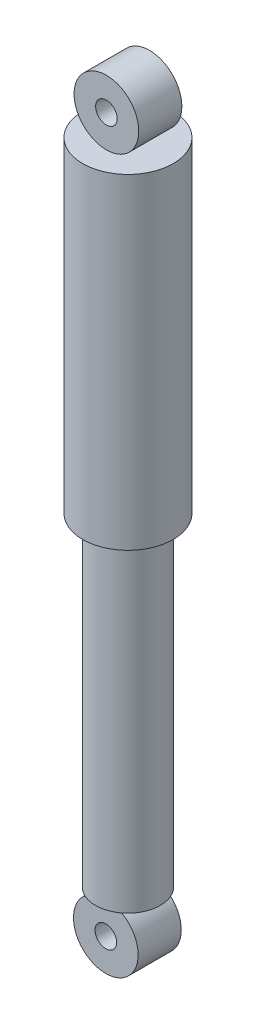
ISO-10303-21;
HEADER;
FILE_DESCRIPTION(('STEP AP214'),'2;1');
FILE_NAME('part.step','',(''),(''),'','','');
FILE_SCHEMA(('AUTOMOTIVE_DESIGN { 1 0 10303 214 1 1 1 1 }'));
ENDSEC;
DATA;
#1=APPLICATION_CONTEXT('core data for automotive mechanical design processes');
#2=APPLICATION_PROTOCOL_DEFINITION('international standard','automotive_design',2000,#1);
#3=PRODUCT_CONTEXT('',#1,'mechanical');
#4=PRODUCT('Part','Part','',(#3));
#5=PRODUCT_RELATED_PRODUCT_CATEGORY('part','',(#4));
#6=PRODUCT_DEFINITION_FORMATION('','',#4);
#7=PRODUCT_DEFINITION_CONTEXT('part definition',#1,'design');
#8=PRODUCT_DEFINITION('design','',#6,#7);
#9=PRODUCT_DEFINITION_SHAPE('','',#8);
#10=(LENGTH_UNIT() NAMED_UNIT(*) SI_UNIT(.MILLI.,.METRE.));
#11=(NAMED_UNIT(*) PLANE_ANGLE_UNIT() SI_UNIT($,.RADIAN.));
#12=(NAMED_UNIT(*) SI_UNIT($,.STERADIAN.) SOLID_ANGLE_UNIT());
#13=UNCERTAINTY_MEASURE_WITH_UNIT(LENGTH_MEASURE(1.E-05),#10,'distance_accuracy_value','');
#14=(GEOMETRIC_REPRESENTATION_CONTEXT(3) GLOBAL_UNCERTAINTY_ASSIGNED_CONTEXT((#13)) GLOBAL_UNIT_ASSIGNED_CONTEXT((#10,
#11,#12)) REPRESENTATION_CONTEXT('',''));
#15=CARTESIAN_POINT('',(0.,0.,0.));
#16=DIRECTION('',(0.,0.,1.));
#17=DIRECTION('',(1.,0.,0.));
#18=AXIS2_PLACEMENT_3D('',#15,#16,#17);
#19=CARTESIAN_POINT('',(0.278925530166028,331.,20.));
#20=DIRECTION('',(0.,0.,-1.));
#21=DIRECTION('',(-1.,0.,0.));
#22=AXIS2_PLACEMENT_3D('',#19,#20,#21);
#23=CYLINDRICAL_SURFACE('',#22,5.);
#24=CARTESIAN_POINT('',(0.278925530166028,331.,20.));
#25=DIRECTION('',(0.,0.,1.));
#26=DIRECTION('',(1.,0.,0.));
#27=AXIS2_PLACEMENT_3D('',#24,#25,#26);
#28=CIRCLE('',#27,5.);
#29=CARTESIAN_POINT('',(5.27892553016603,331.,20.));
#30=VERTEX_POINT('',#29);
#31=EDGE_CURVE('E49',#30,#30,#28,.T.);
#32=ORIENTED_EDGE('',*,*,#31,.T.);
#33=EDGE_LOOP('',(#32));
#34=FACE_BOUND('',#33,.T.);
#35=CARTESIAN_POINT('',(0.278925530166028,331.,0.));
#36=DIRECTION('',(0.,0.,1.));
#37=DIRECTION('',(1.,0.,0.));
#38=AXIS2_PLACEMENT_3D('',#35,#36,#37);
#39=CIRCLE('',#38,5.);
#40=CARTESIAN_POINT('',(5.27892553016603,331.,0.));
#41=VERTEX_POINT('',#40);
#42=EDGE_CURVE('E55',#41,#41,#39,.T.);
#43=ORIENTED_EDGE('',*,*,#42,.F.);
#44=EDGE_LOOP('',(#43));
#45=FACE_BOUND('',#44,.T.);
#46=ADVANCED_FACE('F42',(#34,#45),#23,.F.);
#47=CARTESIAN_POINT('',(0.278925530166028,331.,20.));
#48=DIRECTION('',(0.,0.,-1.));
#49=DIRECTION('',(-1.,0.,0.));
#50=AXIS2_PLACEMENT_3D('',#47,#48,#49);
#51=CYLINDRICAL_SURFACE('',#50,15.);
#52=CARTESIAN_POINT('',(0.278925530166028,331.,20.));
#53=DIRECTION('',(0.,0.,1.));
#54=DIRECTION('',(1.,0.,0.));
#55=AXIS2_PLACEMENT_3D('',#52,#53,#54);
#56=CIRCLE('',#55,15.);
#57=CARTESIAN_POINT('',(15.278925530166,331.,20.));
#58=VERTEX_POINT('',#57);
#59=EDGE_CURVE('E11',#58,#58,#56,.T.);
#60=ORIENTED_EDGE('',*,*,#59,.F.);
#61=EDGE_LOOP('',(#60));
#62=FACE_BOUND('',#61,.T.);
#63=CARTESIAN_POINT('',(0.278925530166028,331.,0.));
#64=DIRECTION('',(0.,0.,1.));
#65=DIRECTION('',(1.,0.,0.));
#66=AXIS2_PLACEMENT_3D('',#63,#64,#65);
#67=CIRCLE('',#66,15.);
#68=CARTESIAN_POINT('',(15.278925530166,331.,0.));
#69=VERTEX_POINT('',#68);
#70=EDGE_CURVE('E45',#69,#69,#67,.T.);
#71=ORIENTED_EDGE('',*,*,#70,.T.);
#72=EDGE_LOOP('',(#71));
#73=FACE_BOUND('',#72,.T.);
#74=ADVANCED_FACE('F62',(#62,#73),#51,.T.);
#75=CARTESIAN_POINT('',(0.,0.,20.));
#76=DIRECTION('',(0.,0.,1.));
#77=DIRECTION('',(1.,0.,0.));
#78=AXIS2_PLACEMENT_3D('',#75,#76,#77);
#79=PLANE('',#78);
#80=ORIENTED_EDGE('',*,*,#31,.F.);
#81=EDGE_LOOP('',(#80));
#82=FACE_BOUND('',#81,.T.);
#83=ORIENTED_EDGE('',*,*,#59,.T.);
#84=EDGE_LOOP('',(#83));
#85=FACE_BOUND('',#84,.T.);
#86=ADVANCED_FACE('F66',(#82,#85),#79,.T.);
#87=CARTESIAN_POINT('',(0.,0.,0.));
#88=DIRECTION('',(0.,0.,1.));
#89=DIRECTION('',(1.,0.,0.));
#90=AXIS2_PLACEMENT_3D('',#87,#88,#89);
#91=PLANE('',#90);
#92=ORIENTED_EDGE('',*,*,#42,.T.);
#93=EDGE_LOOP('',(#92));
#94=FACE_BOUND('',#93,.T.);
#95=ORIENTED_EDGE('',*,*,#70,.F.);
#96=EDGE_LOOP('',(#95));
#97=FACE_BOUND('',#96,.T.);
#98=ADVANCED_FACE('F64',(#94,#97),#91,.F.);
#99=CLOSED_SHELL('',(#46,#74,#86,#98));
#100=MANIFOLD_SOLID_BREP('B2',#99);
#101=CARTESIAN_POINT('',(0.278925530166028,165.,10.));
#102=DIRECTION('',(0.,1.,0.));
#103=DIRECTION('',(0.,0.,1.));
#104=AXIS2_PLACEMENT_3D('',#101,#102,#103);
#105=PLANE('',#104);
#106=CARTESIAN_POINT('',(0.278925530166028,165.,10.));
#107=DIRECTION('',(0.,1.,0.));
#108=DIRECTION('',(0.,0.,1.));
#109=AXIS2_PLACEMENT_3D('',#106,#107,#108);
#110=CIRCLE('',#109,21.);
#111=CARTESIAN_POINT('',(0.278925530166028,165.,31.));
#112=VERTEX_POINT('',#111);
#113=EDGE_CURVE('E41',#112,#112,#110,.T.);
#114=ORIENTED_EDGE('',*,*,#113,.F.);
#115=EDGE_LOOP('',(#114));
#116=FACE_BOUND('',#115,.T.);
#117=CARTESIAN_POINT('',(0.278925530166028,165.,10.));
#118=DIRECTION('',(0.,1.,0.));
#119=DIRECTION('',(0.,0.,1.));
#120=AXIS2_PLACEMENT_3D('',#117,#118,#119);
#121=CIRCLE('',#120,15.5);
#122=CARTESIAN_POINT('',(0.278925530166028,165.,25.5));
#123=VERTEX_POINT('',#122);
#124=EDGE_CURVE('E119',#123,#123,#121,.T.);
#125=ORIENTED_EDGE('',*,*,#124,.T.);
#126=EDGE_LOOP('',(#125));
#127=FACE_BOUND('',#126,.T.);
#128=ADVANCED_FACE('F112',(#116,#127),#105,.F.);
#129=CARTESIAN_POINT('',(0.278925530166028,315.,10.));
#130=DIRECTION('',(0.,-1.,0.));
#131=DIRECTION('',(0.,0.,-1.));
#132=AXIS2_PLACEMENT_3D('',#129,#130,#131);
#133=CYLINDRICAL_SURFACE('',#132,21.);
#134=ORIENTED_EDGE('',*,*,#113,.T.);
#135=EDGE_LOOP('',(#134));
#136=FACE_BOUND('',#135,.T.);
#137=CARTESIAN_POINT('',(0.278925530166028,316.,10.));
#138=DIRECTION('',(0.,1.,0.));
#139=DIRECTION('',(0.,0.,1.));
#140=AXIS2_PLACEMENT_3D('',#137,#138,#139);
#141=CIRCLE('',#140,21.);
#142=CARTESIAN_POINT('',(0.278925530166028,316.,31.));
#143=VERTEX_POINT('',#142);
#144=EDGE_CURVE('E127',#143,#143,#141,.T.);
#145=ORIENTED_EDGE('',*,*,#144,.F.);
#146=EDGE_LOOP('',(#145));
#147=FACE_BOUND('',#146,.T.);
#148=ADVANCED_FACE('F114',(#136,#147),#133,.T.);
#149=CARTESIAN_POINT('',(0.278925530166028,315.,10.));
#150=DIRECTION('',(0.,-1.,0.));
#151=DIRECTION('',(0.,0.,-1.));
#152=AXIS2_PLACEMENT_3D('',#149,#150,#151);
#153=CYLINDRICAL_SURFACE('',#152,15.5);
#154=CARTESIAN_POINT('',(0.278925530166028,315.,10.));
#155=DIRECTION('',(0.,1.,0.));
#156=DIRECTION('',(0.,0.,1.));
#157=AXIS2_PLACEMENT_3D('',#154,#155,#156);
#158=CIRCLE('',#157,15.5);
#159=CARTESIAN_POINT('',(0.278925530166028,315.,25.5));
#160=VERTEX_POINT('',#159);
#161=EDGE_CURVE('E123',#160,#160,#158,.T.);
#162=ORIENTED_EDGE('',*,*,#161,.T.);
#163=EDGE_LOOP('',(#162));
#164=FACE_BOUND('',#163,.T.);
#165=ORIENTED_EDGE('',*,*,#124,.F.);
#166=EDGE_LOOP('',(#165));
#167=FACE_BOUND('',#166,.T.);
#168=ADVANCED_FACE('F136',(#164,#167),#153,.F.);
#169=CARTESIAN_POINT('',(0.278925530166028,315.,10.));
#170=DIRECTION('',(0.,1.,0.));
#171=DIRECTION('',(0.,0.,1.));
#172=AXIS2_PLACEMENT_3D('',#169,#170,#171);
#173=PLANE('',#172);
#174=ORIENTED_EDGE('',*,*,#161,.F.);
#175=EDGE_LOOP('',(#174));
#176=FACE_BOUND('',#175,.T.);
#177=ADVANCED_FACE('F141',(#176),#173,.F.);
#178=CARTESIAN_POINT('',(0.278925530166028,316.,10.));
#179=DIRECTION('',(0.,1.,0.));
#180=DIRECTION('',(0.,0.,1.));
#181=AXIS2_PLACEMENT_3D('',#178,#179,#180);
#182=PLANE('',#181);
#183=ORIENTED_EDGE('',*,*,#144,.T.);
#184=EDGE_LOOP('',(#183));
#185=FACE_BOUND('',#184,.T.);
#186=ADVANCED_FACE('F133',(#185),#182,.T.);
#187=CLOSED_SHELL('',(#128,#148,#168,#177,#186));
#188=MANIFOLD_SOLID_BREP('B6',#187);
#189=CARTESIAN_POINT('',(0.278925530166028,165.,10.));
#190=DIRECTION('',(0.,-1.,0.));
#191=DIRECTION('',(0.,0.,-1.));
#192=AXIS2_PLACEMENT_3D('',#189,#190,#191);
#193=CYLINDRICAL_SURFACE('',#192,15.);
#194=CARTESIAN_POINT('',(0.278925530166028,165.,10.));
#195=DIRECTION('',(0.,1.,0.));
#196=DIRECTION('',(0.,0.,1.));
#197=AXIS2_PLACEMENT_3D('',#194,#195,#196);
#198=CIRCLE('',#197,15.);
#199=CARTESIAN_POINT('',(0.278925530166028,165.,25.));
#200=VERTEX_POINT('',#199);
#201=EDGE_CURVE('E111',#200,#200,#198,.T.);
#202=ORIENTED_EDGE('',*,*,#201,.F.);
#203=EDGE_LOOP('',(#202));
#204=FACE_BOUND('',#203,.T.);
#205=CARTESIAN_POINT('',(0.278925530166028,15.,10.));
#206=DIRECTION('',(0.,1.,0.));
#207=DIRECTION('',(0.,0.,1.));
#208=AXIS2_PLACEMENT_3D('',#205,#206,#207);
#209=CIRCLE('',#208,15.);
#210=CARTESIAN_POINT('',(0.278925530166028,15.,25.));
#211=VERTEX_POINT('',#210);
#212=EDGE_CURVE('E194',#211,#211,#209,.T.);
#213=ORIENTED_EDGE('',*,*,#212,.T.);
#214=EDGE_LOOP('',(#213));
#215=FACE_BOUND('',#214,.T.);
#216=ADVANCED_FACE('F191',(#204,#215),#193,.T.);
#217=CARTESIAN_POINT('',(0.278925530166028,165.,10.));
#218=DIRECTION('',(0.,1.,0.));
#219=DIRECTION('',(0.,0.,1.));
#220=AXIS2_PLACEMENT_3D('',#217,#218,#219);
#221=PLANE('',#220);
#222=ORIENTED_EDGE('',*,*,#201,.T.);
#223=EDGE_LOOP('',(#222));
#224=FACE_BOUND('',#223,.T.);
#225=ADVANCED_FACE('F206',(#224),#221,.T.);
#226=CARTESIAN_POINT('',(0.278925530166028,15.,10.));
#227=DIRECTION('',(0.,1.,0.));
#228=DIRECTION('',(0.,0.,1.));
#229=AXIS2_PLACEMENT_3D('',#226,#227,#228);
#230=PLANE('',#229);
#231=ORIENTED_EDGE('',*,*,#212,.F.);
#232=EDGE_LOOP('',(#231));
#233=FACE_BOUND('',#232,.T.);
#234=ADVANCED_FACE('F204',(#233),#230,.F.);
#235=CLOSED_SHELL('',(#216,#225,#234));
#236=MANIFOLD_SOLID_BREP('B36',#235);
#237=CARTESIAN_POINT('',(0.,0.,20.));
#238=DIRECTION('',(0.,0.,-1.));
#239=DIRECTION('',(-1.,0.,0.));
#240=AXIS2_PLACEMENT_3D('',#237,#238,#239);
#241=CYLINDRICAL_SURFACE('',#240,15.);
#242=CARTESIAN_POINT('',(0.,0.,20.));
#243=DIRECTION('',(0.,0.,1.));
#244=DIRECTION('',(1.,0.,0.));
#245=AXIS2_PLACEMENT_3D('',#242,#243,#244);
#246=CIRCLE('',#245,15.);
#247=CARTESIAN_POINT('',(15.,0.,20.));
#248=VERTEX_POINT('',#247);
#249=EDGE_CURVE('E190',#248,#248,#246,.T.);
#250=ORIENTED_EDGE('',*,*,#249,.F.);
#251=EDGE_LOOP('',(#250));
#252=FACE_BOUND('',#251,.T.);
#253=CARTESIAN_POINT('',(0.,0.,0.));
#254=DIRECTION('',(0.,0.,1.));
#255=DIRECTION('',(1.,0.,0.));
#256=AXIS2_PLACEMENT_3D('',#253,#254,#255);
#257=CIRCLE('',#256,15.);
#258=CARTESIAN_POINT('',(15.,0.,0.));
#259=VERTEX_POINT('',#258);
#260=EDGE_CURVE('E235',#259,#259,#257,.T.);
#261=ORIENTED_EDGE('',*,*,#260,.T.);
#262=EDGE_LOOP('',(#261));
#263=FACE_BOUND('',#262,.T.);
#264=ADVANCED_FACE('F232',(#252,#263),#241,.T.);
#265=CARTESIAN_POINT('',(0.,0.,20.));
#266=DIRECTION('',(0.,0.,1.));
#267=DIRECTION('',(1.,0.,0.));
#268=AXIS2_PLACEMENT_3D('',#265,#266,#267);
#269=PLANE('',#268);
#270=CARTESIAN_POINT('',(0.,0.,20.));
#271=DIRECTION('',(0.,0.,1.));
#272=DIRECTION('',(1.,0.,0.));
#273=AXIS2_PLACEMENT_3D('',#270,#271,#272);
#274=CIRCLE('',#273,5.);
#275=CARTESIAN_POINT('',(5.,0.,20.));
#276=VERTEX_POINT('',#275);
#277=EDGE_CURVE('E244',#276,#276,#274,.T.);
#278=ORIENTED_EDGE('',*,*,#277,.F.);
#279=EDGE_LOOP('',(#278));
#280=FACE_BOUND('',#279,.T.);
#281=ORIENTED_EDGE('',*,*,#249,.T.);
#282=EDGE_LOOP('',(#281));
#283=FACE_BOUND('',#282,.T.);
#284=ADVANCED_FACE('F259',(#280,#283),#269,.T.);
#285=CARTESIAN_POINT('',(0.,0.,0.));
#286=DIRECTION('',(0.,0.,1.));
#287=DIRECTION('',(1.,0.,0.));
#288=AXIS2_PLACEMENT_3D('',#285,#286,#287);
#289=PLANE('',#288);
#290=CARTESIAN_POINT('',(0.,0.,0.));
#291=DIRECTION('',(0.,0.,1.));
#292=DIRECTION('',(1.,0.,0.));
#293=AXIS2_PLACEMENT_3D('',#290,#291,#292);
#294=CIRCLE('',#293,5.);
#295=CARTESIAN_POINT('',(5.,0.,0.));
#296=VERTEX_POINT('',#295);
#297=EDGE_CURVE('E242',#296,#296,#294,.T.);
#298=ORIENTED_EDGE('',*,*,#297,.T.);
#299=EDGE_LOOP('',(#298));
#300=FACE_BOUND('',#299,.T.);
#301=ORIENTED_EDGE('',*,*,#260,.F.);
#302=EDGE_LOOP('',(#301));
#303=FACE_BOUND('',#302,.T.);
#304=ADVANCED_FACE('F250',(#300,#303),#289,.F.);
#305=CARTESIAN_POINT('',(0.,0.,0.));
#306=DIRECTION('',(0.,0.,1.));
#307=DIRECTION('',(1.,0.,0.));
#308=AXIS2_PLACEMENT_3D('',#305,#306,#307);
#309=CYLINDRICAL_SURFACE('',#308,5.);
#310=ORIENTED_EDGE('',*,*,#297,.F.);
#311=EDGE_LOOP('',(#310));
#312=FACE_BOUND('',#311,.T.);
#313=ORIENTED_EDGE('',*,*,#277,.T.);
#314=EDGE_LOOP('',(#313));
#315=FACE_BOUND('',#314,.T.);
#316=ADVANCED_FACE('F253',(#312,#315),#309,.F.);
#317=CLOSED_SHELL('',(#264,#284,#304,#316));
#318=MANIFOLD_SOLID_BREP('B106',#317);
#319=ADVANCED_BREP_SHAPE_REPRESENTATION('',(#18,#100,#188,#236,#318),#14);
#320=SHAPE_DEFINITION_REPRESENTATION(#9,#319);
ENDSEC;
END-ISO-10303-21;
